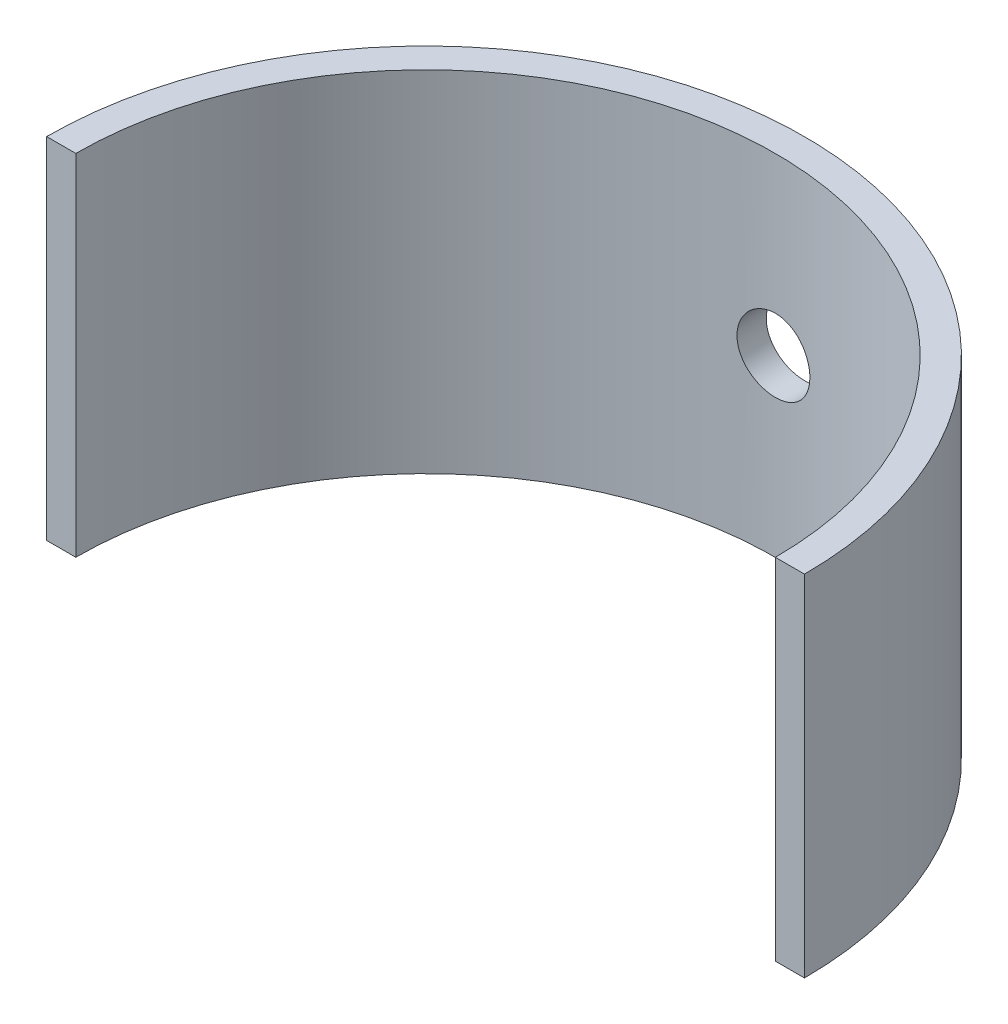
ISO-10303-21;
HEADER;
FILE_DESCRIPTION(('STEP AP214'),'2;1');
FILE_NAME('part.step','',(''),(''),'','','');
FILE_SCHEMA(('AUTOMOTIVE_DESIGN { 1 0 10303 214 1 1 1 1 }'));
ENDSEC;
DATA;
#1=APPLICATION_CONTEXT('core data for automotive mechanical design processes');
#2=APPLICATION_PROTOCOL_DEFINITION('international standard','automotive_design',2000,#1);
#3=PRODUCT_CONTEXT('',#1,'mechanical');
#4=PRODUCT('Part','Part','',(#3));
#5=PRODUCT_RELATED_PRODUCT_CATEGORY('part','',(#4));
#6=PRODUCT_DEFINITION_FORMATION('','',#4);
#7=PRODUCT_DEFINITION_CONTEXT('part definition',#1,'design');
#8=PRODUCT_DEFINITION('design','',#6,#7);
#9=PRODUCT_DEFINITION_SHAPE('','',#8);
#10=(LENGTH_UNIT() NAMED_UNIT(*) SI_UNIT(.MILLI.,.METRE.));
#11=(NAMED_UNIT(*) PLANE_ANGLE_UNIT() SI_UNIT($,.RADIAN.));
#12=(NAMED_UNIT(*) SI_UNIT($,.STERADIAN.) SOLID_ANGLE_UNIT());
#13=UNCERTAINTY_MEASURE_WITH_UNIT(LENGTH_MEASURE(1.E-05),#10,'distance_accuracy_value','');
#14=(GEOMETRIC_REPRESENTATION_CONTEXT(3) GLOBAL_UNCERTAINTY_ASSIGNED_CONTEXT((#13)) GLOBAL_UNIT_ASSIGNED_CONTEXT((#10,
#11,#12)) REPRESENTATION_CONTEXT('',''));
#15=CARTESIAN_POINT('',(0.,0.,0.));
#16=DIRECTION('',(0.,0.,1.));
#17=DIRECTION('',(1.,0.,0.));
#18=AXIS2_PLACEMENT_3D('',#15,#16,#17);
#19=CARTESIAN_POINT('',(0.,25.2479742173112,0.));
#20=DIRECTION('',(0.,-1.,0.));
#21=DIRECTION('',(0.,0.,-1.));
#22=AXIS2_PLACEMENT_3D('',#19,#20,#21);
#23=CYLINDRICAL_SURFACE('',#22,24.);
#24=CARTESIAN_POINT('',(0.,14.5,-24.));
#25=CARTESIAN_POINT('',(-0.140019098975934,14.4999939524396,-23.9999983285743));
#26=CARTESIAN_POINT('',(-0.280130004820107,14.4881971776145,-23.9987616574237));
#27=CARTESIAN_POINT('',(-0.556465216970758,14.4413168453541,-23.9939472529236));
#28=CARTESIAN_POINT('',(-0.692685105229997,14.4062078350759,-23.9903669608147));
#29=CARTESIAN_POINT('',(-0.95719682623585,14.3137380998681,-23.9812693424692));
#30=CARTESIAN_POINT('',(-1.08549347464071,14.2563910483903,-23.9757532067178));
#31=CARTESIAN_POINT('',(-1.33061300782506,14.1211001811367,-23.9634002010905));
#32=CARTESIAN_POINT('',(-1.44743812037171,14.0431603753583,-23.9565635884189));
#33=CARTESIAN_POINT('',(-1.66678002728959,13.8685714092772,-23.9423053503845));
#34=CARTESIAN_POINT('',(-1.76924592098801,13.7718584533112,-23.9348817828898));
#35=CARTESIAN_POINT('',(-1.95652312400132,13.5626047753798,-23.9203023150328));
#36=CARTESIAN_POINT('',(-2.04133360475134,13.4500633110007,-23.9131464272456));
#37=CARTESIAN_POINT('',(-2.1910743933879,13.2120265893018,-23.8998928263589));
#38=CARTESIAN_POINT('',(-2.25595836587485,13.0865020340063,-23.8937975936551));
#39=CARTESIAN_POINT('',(-2.36370845437138,12.8262651943793,-23.8833797873275));
#40=CARTESIAN_POINT('',(-2.40657515792608,12.6915531553305,-23.8790571664012));
#41=CARTESIAN_POINT('',(-2.46892233098411,12.4172861025866,-23.8726917457921));
#42=CARTESIAN_POINT('',(-2.48848749606453,12.277750536947,-23.8706406914203));
#43=CARTESIAN_POINT('',(-2.5039380600927,11.9973622877022,-23.8690250709754));
#44=CARTESIAN_POINT('',(-2.49982413114388,11.856509641594,-23.8694604343282));
#45=CARTESIAN_POINT('',(-2.46810305013949,11.5780703208288,-23.8727609172094));
#46=CARTESIAN_POINT('',(-2.44058849696532,11.4404729673765,-23.8756164596649));
#47=CARTESIAN_POINT('',(-2.36299134636478,11.1718596773911,-23.8834205984461));
#48=CARTESIAN_POINT('',(-2.31290842077499,11.0408438365897,-23.888369225207));
#49=CARTESIAN_POINT('',(-2.19149439224966,10.7888208498771,-23.8998129461151));
#50=CARTESIAN_POINT('',(-2.12012233445415,10.6678335749082,-23.906311016118));
#51=CARTESIAN_POINT('',(-1.95818544027187,10.4395195930894,-23.9201189751535));
#52=CARTESIAN_POINT('',(-1.86761999412767,10.3321933204112,-23.9274288899742));
#53=CARTESIAN_POINT('',(-1.6693505618762,10.1337099453548,-23.9420795604612));
#54=CARTESIAN_POINT('',(-1.56156662831567,10.0426326837163,-23.9494202962999));
#55=CARTESIAN_POINT('',(-1.33219706437878,9.87985193423496,-23.9632725073772));
#56=CARTESIAN_POINT('',(-1.21061141645981,9.80814847101755,-23.9697839815618));
#57=CARTESIAN_POINT('',(-0.957033529843522,9.68615342689168,-23.9812464075752));
#58=CARTESIAN_POINT('',(-0.825039258595363,9.63586604035431,-23.9861970536643));
#59=CARTESIAN_POINT('',(-0.554417675293399,9.55818987261738,-23.9939769619749));
#60=CARTESIAN_POINT('',(-0.415790578680587,9.5308003482048,-23.9968062930494));
#61=CARTESIAN_POINT('',(-0.136529717387728,9.49979901223015,-24.0000159220723));
#62=CARTESIAN_POINT('',(0.00409169483293472,9.4960770553803,-24.0004075644754));
#63=CARTESIAN_POINT('',(0.283956285440749,9.51222700425295,-23.9987281398383));
#64=CARTESIAN_POINT('',(0.423199484030556,9.53209856360998,-23.9966571089516));
#65=CARTESIAN_POINT('',(0.696036058953868,9.59478006564383,-23.990292281904));
#66=CARTESIAN_POINT('',(0.829641443373487,9.63753829221084,-23.9860034978517));
#67=CARTESIAN_POINT('',(1.08778344765257,9.744726138559,-23.9756841475199));
#68=CARTESIAN_POINT('',(1.21231984780486,9.8091562831564,-23.9696535390603));
#69=CARTESIAN_POINT('',(1.44928583800463,9.95813117863983,-23.9564964785007));
#70=CARTESIAN_POINT('',(1.56166981878305,10.0427481275795,-23.9493661262919));
#71=CARTESIAN_POINT('',(1.77067876576551,10.2295913579541,-23.9348217954334));
#72=CARTESIAN_POINT('',(1.86730330198222,10.3318181197062,-23.9274078090518));
#73=CARTESIAN_POINT('',(2.04243425512498,10.551460441381,-23.9130975449897));
#74=CARTESIAN_POINT('',(2.1208682715977,10.6689338887089,-23.906203407379));
#75=CARTESIAN_POINT('',(2.25689364805606,10.9154501288022,-23.8937463896306));
#76=CARTESIAN_POINT('',(2.31448531389296,11.0444927517608,-23.8881834899581));
#77=CARTESIAN_POINT('',(2.40707056773841,11.310238233688,-23.8790323594731));
#78=CARTESIAN_POINT('',(2.44210689059251,11.446926070032,-23.8754403963128));
#79=CARTESIAN_POINT('',(2.48872541812748,11.7242840028033,-23.8706263818041));
#80=CARTESIAN_POINT('',(2.50030835797526,11.864953974267,-23.8694042561711));
#81=CARTESIAN_POINT('',(2.49968062512839,12.1455633804219,-23.8694699469516));
#82=CARTESIAN_POINT('',(2.48758368273608,12.2855030861957,-23.8707457661821));
#83=CARTESIAN_POINT('',(2.44017839358427,12.5613504543774,-23.8756379811738));
#84=CARTESIAN_POINT('',(2.40487002375295,12.6972581127772,-23.8792543792615));
#85=CARTESIAN_POINT('',(2.31207619267995,12.9611804273865,-23.8884168890396));
#86=CARTESIAN_POINT('',(2.25459440301192,13.0891963862705,-23.8939626812374));
#87=CARTESIAN_POINT('',(2.11909702330072,13.3337818033544,-23.9063597375252));
#88=CARTESIAN_POINT('',(2.04108149115675,13.4503512938286,-23.9132109979343));
#89=CARTESIAN_POINT('',(1.86630467547618,13.6693175612825,-23.9274864604945));
#90=CARTESIAN_POINT('',(1.7694585981906,13.7716464960921,-23.9349131592601));
#91=CARTESIAN_POINT('',(1.55993972507877,13.9586493105228,-23.9494799850001));
#92=CARTESIAN_POINT('',(1.44726315365172,14.0433189663708,-23.9566200430864));
#93=CARTESIAN_POINT('',(1.20894495629054,14.1927828573143,-23.9698294240292));
#94=CARTESIAN_POINT('',(1.08326906933242,14.2575226851661,-23.9758957969554));
#95=CARTESIAN_POINT('',(0.822845687629868,14.3648929826175,-23.9862426738721));
#96=CARTESIAN_POINT('',(0.688108558013652,14.4075482445085,-23.9905251793844));
#97=CARTESIAN_POINT('',(0.460515126286011,14.4589663649199,-23.9957523055139));
#98=CARTESIAN_POINT('',(0.369110979440146,14.4743327909837,-23.9973377133261));
#99=CARTESIAN_POINT('',(0.185151268122166,14.4948515848398,-23.999462110842));
#100=CARTESIAN_POINT('',(0.0925957089126051,14.5000039992983,-24.0000011053267));
#101=CARTESIAN_POINT('',(0.,14.5,-24.));
#102=B_SPLINE_CURVE_WITH_KNOTS('',3,(#24,#25,#26,#27,#28,#29,#30,#31,#32,#33,#34,#35,#36,#37,
#38,#39,#40,#41,#42,#43,#44,#45,#46,#47,#48,#49,#50,#51,#52,#53,#54,#55,#56,#57,#58,#59,#60,#61,
#62,#63,#64,#65,#66,#67,#68,#69,#70,#71,#72,#73,#74,#75,#76,#77,#78,#79,#80,#81,#82,#83,#84,#85,
#86,#87,#88,#89,#90,#91,#92,#93,#94,#95,#96,#97,#98,#99,#100,#101),.UNSPECIFIED.,.T.,.F.,(4,2,2,
2,2,2,2,2,2,2,2,2,2,2,2,2,2,2,2,2,2,2,2,2,2,2,2,2,2,2,2,2,2,2,2,2,2,2,4),(0.,0.419719157617769,
0.839897329596875,1.25981755622152,1.67965607257316,2.1009470998907,2.52225789385386,
2.94454107701046,3.3668129906807,3.78754531544128,4.2082656982652,4.62732894853741,
5.04639829254417,5.46627907630134,5.88617320130994,6.30807685894985,6.7299810528543,
7.15196783937662,7.5739409286265,7.99394877271383,8.41395045093732,8.83300704973816,
9.2520737973199,9.67266241890496,10.0932625140886,10.5155089696292,10.9377492286589,
11.3591871103767,11.7806117815494,12.2000173897592,12.6194234148526,13.0387600226179,
13.4580954479887,13.8793647966139,14.3007347898249,14.7232451007335,15.1452800644659,
15.4228448452225,15.7004083578294),.UNSPECIFIED.);
#103=CARTESIAN_POINT('',(0.,14.5,-24.));
#104=VERTEX_POINT('',#103);
#105=EDGE_CURVE('E104',#104,#104,#102,.T.);
#106=ORIENTED_EDGE('',*,*,#105,.F.);
#107=EDGE_LOOP('',(#106));
#108=FACE_BOUND('',#107,.T.);
#109=CARTESIAN_POINT('',(0.,0.,0.));
#110=DIRECTION('',(0.,-1.,0.));
#111=DIRECTION('',(0.,0.,-1.));
#112=AXIS2_PLACEMENT_3D('',#109,#110,#111);
#113=CIRCLE('',#112,24.);
#114=CARTESIAN_POINT('',(-24.,0.,1.6759110426447E-13));
#115=VERTEX_POINT('',#114);
#116=CARTESIAN_POINT('',(24.,0.,0.));
#117=VERTEX_POINT('',#116);
#118=EDGE_CURVE('E54',#115,#117,#113,.T.);
#119=ORIENTED_EDGE('',*,*,#118,.T.);
#120=DIRECTION('',(0.,-1.,0.));
#121=VECTOR('',#120,1.);
#122=CARTESIAN_POINT('',(24.,24.,0.));
#123=LINE('',#122,#121);
#124=CARTESIAN_POINT('',(24.,24.,0.));
#125=VERTEX_POINT('',#124);
#126=EDGE_CURVE('E87',#125,#117,#123,.T.);
#127=ORIENTED_EDGE('',*,*,#126,.F.);
#128=CARTESIAN_POINT('',(0.,24.,0.));
#129=DIRECTION('',(0.,-1.,0.));
#130=DIRECTION('',(0.,0.,-1.));
#131=AXIS2_PLACEMENT_3D('',#128,#129,#130);
#132=CIRCLE('',#131,24.);
#133=CARTESIAN_POINT('',(-24.,24.,1.6759110426447E-13));
#134=VERTEX_POINT('',#133);
#135=EDGE_CURVE('E61',#134,#125,#132,.T.);
#136=ORIENTED_EDGE('',*,*,#135,.F.);
#137=DIRECTION('',(0.,-1.,0.));
#138=VECTOR('',#137,1.);
#139=CARTESIAN_POINT('',(-24.,24.,1.6759110426447E-13));
#140=LINE('',#139,#138);
#141=EDGE_CURVE('E89',#134,#115,#140,.T.);
#142=ORIENTED_EDGE('',*,*,#141,.T.);
#143=EDGE_LOOP('',(#119,#127,#136,#142));
#144=FACE_BOUND('',#143,.T.);
#145=ADVANCED_FACE('F41',(#108,#144),#23,.F.);
#146=CARTESIAN_POINT('',(-24.,0.,1.6759110426447E-13));
#147=DIRECTION('',(0.,-1.,0.));
#148=DIRECTION('',(0.,0.,-1.));
#149=AXIS2_PLACEMENT_3D('',#146,#147,#148);
#150=PLANE('',#149);
#151=CARTESIAN_POINT('',(0.,0.,0.));
#152=DIRECTION('',(0.,-1.,0.));
#153=DIRECTION('',(0.,0.,-1.));
#154=AXIS2_PLACEMENT_3D('',#151,#152,#153);
#155=CIRCLE('',#154,26.);
#156=CARTESIAN_POINT('',(-26.,0.,1.81557029619843E-13));
#157=VERTEX_POINT('',#156);
#158=CARTESIAN_POINT('',(26.,0.,0.));
#159=VERTEX_POINT('',#158);
#160=EDGE_CURVE('E95',#157,#159,#155,.T.);
#161=ORIENTED_EDGE('',*,*,#160,.T.);
#162=DIRECTION('',(1.,0.,0.));
#163=VECTOR('',#162,1.);
#164=CARTESIAN_POINT('',(24.,0.,0.));
#165=LINE('',#164,#163);
#166=EDGE_CURVE('E100',#117,#159,#165,.T.);
#167=ORIENTED_EDGE('',*,*,#166,.F.);
#168=ORIENTED_EDGE('',*,*,#118,.F.);
#169=DIRECTION('',(-1.,0.,0.));
#170=VECTOR('',#169,1.);
#171=CARTESIAN_POINT('',(-24.,0.,1.6759110426447E-13));
#172=LINE('',#171,#170);
#173=EDGE_CURVE('E118',#115,#157,#172,.T.);
#174=ORIENTED_EDGE('',*,*,#173,.T.);
#175=EDGE_LOOP('',(#161,#167,#168,#174));
#176=FACE_BOUND('',#175,.T.);
#177=ADVANCED_FACE('F43',(#176),#150,.T.);
#178=CARTESIAN_POINT('',(0.,25.2479742173112,0.));
#179=DIRECTION('',(0.,-1.,0.));
#180=DIRECTION('',(0.,0.,-1.));
#181=AXIS2_PLACEMENT_3D('',#178,#179,#180);
#182=CYLINDRICAL_SURFACE('',#181,26.);
#183=CARTESIAN_POINT('',(0.,9.5,-26.));
#184=CARTESIAN_POINT('',(-0.140079090854674,9.50000607954472,-25.9999984437906));
#185=CARTESIAN_POINT('',(-0.28025147342537,9.51181292045134,-25.9988559141148));
#186=CARTESIAN_POINT('',(-0.556712047945503,9.558735575232,-25.9944079975224));
#187=CARTESIAN_POINT('',(-0.69299575552845,9.59387724867596,-25.9911002111345));
#188=CARTESIAN_POINT('',(-0.957635386774747,9.68643877375372,-25.9826952711498));
#189=CARTESIAN_POINT('',(-1.08599597155153,9.74384537947572,-25.9775991816262));
#190=CARTESIAN_POINT('',(-1.33123092777167,9.87928197942211,-25.9661878781254));
#191=CARTESIAN_POINT('',(-1.44810761925297,9.95730779624205,-25.9598729111596));
#192=CARTESIAN_POINT('',(-1.66747611994793,10.1320479947142,-25.9467079644338));
#193=CARTESIAN_POINT('',(-1.76992420977562,10.2288171512393,-25.9398564525333));
#194=CARTESIAN_POINT('',(-1.95715176372564,10.4381804953508,-25.9264033385004));
#195=CARTESIAN_POINT('',(-2.04193042099749,10.5507754052057,-25.9198017477916));
#196=CARTESIAN_POINT('',(-2.19156588685477,10.7888657687647,-25.9075800992323));
#197=CARTESIAN_POINT('',(-2.25638338608996,10.9143860361369,-25.9019619874055));
#198=CARTESIAN_POINT('',(-2.36400558433372,11.1745917865878,-25.8923620817987));
#199=CARTESIAN_POINT('',(-2.4068107887361,11.3092770591611,-25.8883802504507));
#200=CARTESIAN_POINT('',(-2.46906431941264,11.5835453932253,-25.8825173839812));
#201=CARTESIAN_POINT('',(-2.48858488177616,11.7231119173661,-25.8806298529777));
#202=CARTESIAN_POINT('',(-2.50393827325608,12.003552123584,-25.8791490548213));
#203=CARTESIAN_POINT('',(-2.4997716809479,12.1444257736498,-25.8795557316307));
#204=CARTESIAN_POINT('',(-2.46792861461947,12.4229841209804,-25.8826114739717));
#205=CARTESIAN_POINT('',(-2.44033092173844,12.5606779180196,-25.8852530251998));
#206=CARTESIAN_POINT('',(-2.36253158706053,12.8294701753833,-25.8924691316369));
#207=CARTESIAN_POINT('',(-2.31232966068504,12.960568552651,-25.8970437111818));
#208=CARTESIAN_POINT('',(-2.19065964060155,13.2126979766694,-25.9076190837894));
#209=CARTESIAN_POINT('',(-2.11915649747562,13.3337120071788,-25.9136222241315));
#210=CARTESIAN_POINT('',(-1.95693896043828,13.5620514185925,-25.9263762889278));
#211=CARTESIAN_POINT('',(-1.86622404692757,13.6693764291394,-25.9331272336046));
#212=CARTESIAN_POINT('',(-1.66771756427794,13.8677490999357,-25.9466497190775));
#213=CARTESIAN_POINT('',(-1.55985794057085,13.9587286755267,-25.9534212317548));
#214=CARTESIAN_POINT('',(-1.33036036240692,14.1213005107823,-25.9661958524457));
#215=CARTESIAN_POINT('',(-1.20872239421451,14.1928927511195,-25.9721989596933));
#216=CARTESIAN_POINT('',(-0.95507452986496,14.314654572159,-25.9827621399536));
#217=CARTESIAN_POINT('',(-0.823063017475296,14.3648208067521,-25.9873219875431));
#218=CARTESIAN_POINT('',(-0.552437151847806,14.4422572334155,-25.9944825144887));
#219=CARTESIAN_POINT('',(-0.413822981243295,14.469528058398,-25.9970832480017));
#220=CARTESIAN_POINT('',(-0.134516292943434,14.500313423012,-26.0000255598987));
#221=CARTESIAN_POINT('',(0.00616577666778944,14.5039219368079,-26.0003760748421));
#222=CARTESIAN_POINT('',(0.2861327320744,14.4875269091482,-25.9988023954169));
#223=CARTESIAN_POINT('',(0.425417635276592,14.4675236622326,-25.9968782294233));
#224=CARTESIAN_POINT('',(0.698366045012002,14.4045508762007,-25.9909771818486));
#225=CARTESIAN_POINT('',(0.83203976993663,14.3616252288135,-25.9870042237842));
#226=CARTESIAN_POINT('',(1.09028867454177,14.2540711814364,-25.9774514488813));
#227=CARTESIAN_POINT('',(1.21486366480819,14.1894423297939,-25.971871598603));
#228=CARTESIAN_POINT('',(1.45180444623829,14.0400826287288,-25.959707247497));
#229=CARTESIAN_POINT('',(1.56413107702372,13.9552899101502,-25.9531196773054));
#230=CARTESIAN_POINT('',(1.77299047000321,13.7680983022725,-25.9396892637475));
#231=CARTESIAN_POINT('',(1.86952286602532,13.6656990048971,-25.9328464144675));
#232=CARTESIAN_POINT('',(2.04437890877741,13.4457914914339,-25.9196498912404));
#233=CARTESIAN_POINT('',(2.12264096626376,13.3282341871747,-25.9132979188272));
#234=CARTESIAN_POINT('',(2.25831163866801,13.0815903444793,-25.9018278100116));
#235=CARTESIAN_POINT('',(2.31572052004912,12.9525039533887,-25.8967096578435));
#236=CARTESIAN_POINT('',(2.40795165942865,12.686679134506,-25.8882970631817));
#237=CARTESIAN_POINT('',(2.44281082321463,12.5499536097823,-25.884999642107));
#238=CARTESIAN_POINT('',(2.48907285341935,12.2725568158129,-25.8805924383109));
#239=CARTESIAN_POINT('',(2.50047633736267,12.1318856505441,-25.8794825979963));
#240=CARTESIAN_POINT('',(2.49949509488684,11.8512028378354,-25.8795773402073));
#241=CARTESIAN_POINT('',(2.48720712118754,11.7111908388983,-25.8807725093909));
#242=CARTESIAN_POINT('',(2.43939436217776,11.435229742357,-25.8853225515069));
#243=CARTESIAN_POINT('',(2.40386954819407,11.2992806497663,-25.8886774271044));
#244=CARTESIAN_POINT('',(2.31061770191278,11.0353034956637,-25.897166294633));
#245=CARTESIAN_POINT('',(2.25289324735919,10.907274516499,-25.9023000799965));
#246=CARTESIAN_POINT('',(2.11689084932903,10.6627075929651,-25.9137687305501));
#247=CARTESIAN_POINT('',(2.03861307185499,10.5461695557977,-25.9201035860394));
#248=CARTESIAN_POINT('',(1.86336245414305,10.3273968050978,-25.9332915481553));
#249=CARTESIAN_POINT('',(1.76631758951772,10.2252199030497,-25.9401465874947));
#250=CARTESIAN_POINT('',(1.55642789703953,10.0385570801371,-25.9535848491687));
#251=CARTESIAN_POINT('',(1.44357928104373,9.95407541295467,-25.9601680058418));
#252=CARTESIAN_POINT('',(1.20499811214645,9.8050475625293,-25.9723366306832));
#253=CARTESIAN_POINT('',(1.07923586421223,9.74054876168741,-25.9779197145149));
#254=CARTESIAN_POINT('',(0.818694200894292,9.63366897565163,-25.987432796859));
#255=CARTESIAN_POINT('',(0.68392519791974,9.59126293224054,-25.9913646672371));
#256=CARTESIAN_POINT('',(0.456987645640417,9.54040237170734,-25.996139051485));
#257=CARTESIAN_POINT('',(0.36627204613264,9.5252720435919,-25.9975801953512));
#258=CARTESIAN_POINT('',(0.183717673427665,9.50506888275136,-25.999511178193));
#259=CARTESIAN_POINT('',(0.0918789044356991,9.49999601238197,-26.0000010207292));
#260=CARTESIAN_POINT('',(0.,9.5,-26.));
#261=B_SPLINE_CURVE_WITH_KNOTS('',3,(#183,#184,#185,#186,#187,#188,#189,#190,#191,#192,#193,
#194,#195,#196,#197,#198,#199,#200,#201,#202,#203,#204,#205,#206,#207,#208,#209,#210,#211,#212,
#213,#214,#215,#216,#217,#218,#219,#220,#221,#222,#223,#224,#225,#226,#227,#228,#229,#230,#231,
#232,#233,#234,#235,#236,#237,#238,#239,#240,#241,#242,#243,#244,#245,#246,#247,#248,#249,#250,
#251,#252,#253,#254,#255,#256,#257,#258,#259,#260),.UNSPECIFIED.,.T.,.F.,(4,2,2,2,2,2,2,2,2,2,2,
2,2,2,2,2,2,2,2,2,2,2,2,2,2,2,2,2,2,2,2,2,2,2,2,2,2,2,4),(0.,0.419901777372054,
0.840269666585885,1.26038785209969,1.68042098780869,2.1017006561163,2.52299955737102,
2.94512289071348,3.3672365318342,3.78803721280071,4.20882761545859,4.62820879438876,
5.04759525331476,5.46767562620043,5.8877673619822,6.3095702920939,6.73137364270306,
7.15324284247045,7.57510037986229,7.99528150261323,8.41545738395726,8.83483158389851,
9.25421451172951,9.67490123167567,10.0955977033983,10.5176924982603,10.9397818993785,
11.3611787321835,11.782564470608,12.2022329710147,12.6219019892742,13.0415222917529,
13.4611392051987,13.8823996846186,14.3037613131246,14.726114539524,15.1479876725087,
15.4234053629249,15.6988220224717),.UNSPECIFIED.);
#262=CARTESIAN_POINT('',(0.,9.5,-26.));
#263=VERTEX_POINT('',#262);
#264=EDGE_CURVE('E11',#263,#263,#261,.T.);
#265=ORIENTED_EDGE('',*,*,#264,.F.);
#266=EDGE_LOOP('',(#265));
#267=FACE_BOUND('',#266,.T.);
#268=CARTESIAN_POINT('',(0.,24.,0.));
#269=DIRECTION('',(0.,-1.,0.));
#270=DIRECTION('',(0.,0.,-1.));
#271=AXIS2_PLACEMENT_3D('',#268,#269,#270);
#272=CIRCLE('',#271,26.);
#273=CARTESIAN_POINT('',(-26.,24.,1.81557029619843E-13));
#274=VERTEX_POINT('',#273);
#275=CARTESIAN_POINT('',(26.,24.,0.));
#276=VERTEX_POINT('',#275);
#277=EDGE_CURVE('E69',#274,#276,#272,.T.);
#278=ORIENTED_EDGE('',*,*,#277,.T.);
#279=DIRECTION('',(0.,1.,0.));
#280=VECTOR('',#279,1.);
#281=CARTESIAN_POINT('',(26.,24.,0.));
#282=LINE('',#281,#280);
#283=EDGE_CURVE('E107',#159,#276,#282,.T.);
#284=ORIENTED_EDGE('',*,*,#283,.F.);
#285=ORIENTED_EDGE('',*,*,#160,.F.);
#286=DIRECTION('',(0.,1.,0.));
#287=VECTOR('',#286,1.);
#288=CARTESIAN_POINT('',(-26.,24.,1.81557029619843E-13));
#289=LINE('',#288,#287);
#290=EDGE_CURVE('E121',#157,#274,#289,.T.);
#291=ORIENTED_EDGE('',*,*,#290,.T.);
#292=EDGE_LOOP('',(#278,#284,#285,#291));
#293=FACE_BOUND('',#292,.T.);
#294=ADVANCED_FACE('F144',(#267,#293),#182,.T.);
#295=CARTESIAN_POINT('',(-24.,24.,1.6759110426447E-13));
#296=DIRECTION('',(0.,1.,0.));
#297=DIRECTION('',(0.,0.,1.));
#298=AXIS2_PLACEMENT_3D('',#295,#296,#297);
#299=PLANE('',#298);
#300=DIRECTION('',(1.,0.,0.));
#301=VECTOR('',#300,1.);
#302=CARTESIAN_POINT('',(-24.,24.,1.6759110426447E-13));
#303=LINE('',#302,#301);
#304=EDGE_CURVE('E124',#274,#134,#303,.T.);
#305=ORIENTED_EDGE('',*,*,#304,.T.);
#306=ORIENTED_EDGE('',*,*,#135,.T.);
#307=DIRECTION('',(-1.,0.,0.));
#308=VECTOR('',#307,1.);
#309=CARTESIAN_POINT('',(24.,24.,0.));
#310=LINE('',#309,#308);
#311=EDGE_CURVE('E102',#276,#125,#310,.T.);
#312=ORIENTED_EDGE('',*,*,#311,.F.);
#313=ORIENTED_EDGE('',*,*,#277,.F.);
#314=EDGE_LOOP('',(#305,#306,#312,#313));
#315=FACE_BOUND('',#314,.T.);
#316=ADVANCED_FACE('F147',(#315),#299,.T.);
#317=CARTESIAN_POINT('',(-24.,24.,1.6759110426447E-13));
#318=DIRECTION('',(0.,0.,-1.));
#319=DIRECTION('',(-1.,0.,0.));
#320=AXIS2_PLACEMENT_3D('',#317,#318,#319);
#321=PLANE('',#320);
#322=ORIENTED_EDGE('',*,*,#141,.F.);
#323=ORIENTED_EDGE('',*,*,#304,.F.);
#324=ORIENTED_EDGE('',*,*,#290,.F.);
#325=ORIENTED_EDGE('',*,*,#173,.F.);
#326=EDGE_LOOP('',(#322,#323,#324,#325));
#327=FACE_BOUND('',#326,.T.);
#328=ADVANCED_FACE('F149',(#327),#321,.F.);
#329=CARTESIAN_POINT('',(24.,24.,0.));
#330=DIRECTION('',(0.,0.,1.));
#331=DIRECTION('',(1.,0.,0.));
#332=AXIS2_PLACEMENT_3D('',#329,#330,#331);
#333=PLANE('',#332);
#334=ORIENTED_EDGE('',*,*,#126,.T.);
#335=ORIENTED_EDGE('',*,*,#166,.T.);
#336=ORIENTED_EDGE('',*,*,#283,.T.);
#337=ORIENTED_EDGE('',*,*,#311,.T.);
#338=EDGE_LOOP('',(#334,#335,#336,#337));
#339=FACE_BOUND('',#338,.T.);
#340=ADVANCED_FACE('F98',(#339),#333,.T.);
#341=CARTESIAN_POINT('',(0.,12.,-26.));
#342=DIRECTION('',(0.,0.,1.));
#343=DIRECTION('',(1.,0.,0.));
#344=AXIS2_PLACEMENT_3D('',#341,#342,#343);
#345=CYLINDRICAL_SURFACE('',#344,2.5);
#346=ORIENTED_EDGE('',*,*,#105,.T.);
#347=EDGE_LOOP('',(#346));
#348=FACE_BOUND('',#347,.T.);
#349=ORIENTED_EDGE('',*,*,#264,.T.);
#350=EDGE_LOOP('',(#349));
#351=FACE_BOUND('',#350,.T.);
#352=ADVANCED_FACE('F156',(#348,#351),#345,.F.);
#353=CLOSED_SHELL('',(#145,#177,#294,#316,#328,#340,#352));
#354=MANIFOLD_SOLID_BREP('B2',#353);
#355=ADVANCED_BREP_SHAPE_REPRESENTATION('',(#18,#354),#14);
#356=SHAPE_DEFINITION_REPRESENTATION(#9,#355);
ENDSEC;
END-ISO-10303-21;
